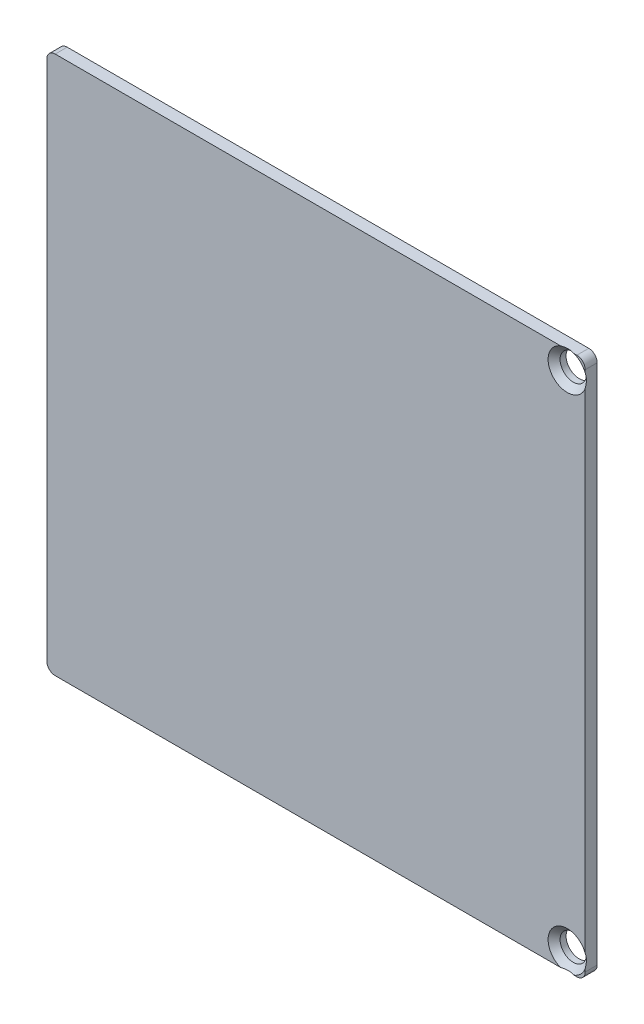
ISO-10303-21;
HEADER;
FILE_DESCRIPTION(('STEP AP214'),'2;1');
FILE_NAME('part.step','',(''),(''),'','','');
FILE_SCHEMA(('AUTOMOTIVE_DESIGN { 1 0 10303 214 1 1 1 1 }'));
ENDSEC;
DATA;
#1=APPLICATION_CONTEXT('core data for automotive mechanical design processes');
#2=APPLICATION_PROTOCOL_DEFINITION('international standard','automotive_design',2000,#1);
#3=PRODUCT_CONTEXT('',#1,'mechanical');
#4=PRODUCT('Part','Part','',(#3));
#5=PRODUCT_RELATED_PRODUCT_CATEGORY('part','',(#4));
#6=PRODUCT_DEFINITION_FORMATION('','',#4);
#7=PRODUCT_DEFINITION_CONTEXT('part definition',#1,'design');
#8=PRODUCT_DEFINITION('design','',#6,#7);
#9=PRODUCT_DEFINITION_SHAPE('','',#8);
#10=(LENGTH_UNIT() NAMED_UNIT(*) SI_UNIT(.MILLI.,.METRE.));
#11=(NAMED_UNIT(*) PLANE_ANGLE_UNIT() SI_UNIT($,.RADIAN.));
#12=(NAMED_UNIT(*) SI_UNIT($,.STERADIAN.) SOLID_ANGLE_UNIT());
#13=UNCERTAINTY_MEASURE_WITH_UNIT(LENGTH_MEASURE(1.E-05),#10,'distance_accuracy_value','');
#14=(GEOMETRIC_REPRESENTATION_CONTEXT(3) GLOBAL_UNCERTAINTY_ASSIGNED_CONTEXT((#13)) GLOBAL_UNIT_ASSIGNED_CONTEXT((#10,
#11,#12)) REPRESENTATION_CONTEXT('',''));
#15=CARTESIAN_POINT('',(0.,0.,0.));
#16=DIRECTION('',(0.,0.,1.));
#17=DIRECTION('',(1.,0.,0.));
#18=AXIS2_PLACEMENT_3D('',#15,#16,#17);
#19=CARTESIAN_POINT('',(21.8,21.8,1.));
#20=DIRECTION('',(0.,0.,1.));
#21=DIRECTION('',(1.,0.,0.));
#22=AXIS2_PLACEMENT_3D('',#19,#20,#21);
#23=PLANE('',#22);
#24=DIRECTION('',(-1.,0.,0.));
#25=VECTOR('',#24,1.);
#26=CARTESIAN_POINT('',(21.8,22.5,1.));
#27=LINE('',#26,#25);
#28=CARTESIAN_POINT('',(21.8,22.5,1.));
#29=VERTEX_POINT('',#28);
#30=CARTESIAN_POINT('',(21.556776436283,22.5,1.));
#31=VERTEX_POINT('',#30);
#32=EDGE_CURVE('E304',#29,#31,#27,.T.);
#33=ORIENTED_EDGE('',*,*,#32,.T.);
#34=CARTESIAN_POINT('',(21.,21.,1.));
#35=DIRECTION('',(0.,0.,1.));
#36=DIRECTION('',(1.,0.,0.));
#37=AXIS2_PLACEMENT_3D('',#34,#35,#36);
#38=CIRCLE('',#37,1.6);
#39=CARTESIAN_POINT('',(22.5,21.556776436283,1.));
#40=VERTEX_POINT('',#39);
#41=EDGE_CURVE('E379',#31,#40,#38,.F.);
#42=ORIENTED_EDGE('',*,*,#41,.T.);
#43=DIRECTION('',(0.,1.,0.));
#44=VECTOR('',#43,1.);
#45=CARTESIAN_POINT('',(22.5,-21.8,1.));
#46=LINE('',#45,#44);
#47=CARTESIAN_POINT('',(22.5,21.8,1.));
#48=VERTEX_POINT('',#47);
#49=EDGE_CURVE('E319',#40,#48,#46,.T.);
#50=ORIENTED_EDGE('',*,*,#49,.T.);
#51=CARTESIAN_POINT('',(21.8,21.8,1.));
#52=DIRECTION('',(0.,0.,1.));
#53=DIRECTION('',(1.,0.,0.));
#54=AXIS2_PLACEMENT_3D('',#51,#52,#53);
#55=CIRCLE('',#54,0.699999999999999);
#56=EDGE_CURVE('E299',#48,#29,#55,.T.);
#57=ORIENTED_EDGE('',*,*,#56,.T.);
#58=EDGE_LOOP('',(#33,#42,#50,#57));
#59=FACE_BOUND('',#58,.T.);
#60=ADVANCED_FACE('F39',(#59),#23,.T.);
#61=CARTESIAN_POINT('',(22.5,-20.443223563717,1.));
#62=VERTEX_POINT('',#61);
#63=CARTESIAN_POINT('',(22.5,20.443223563717,1.));
#64=VERTEX_POINT('',#63);
#65=EDGE_CURVE('E324',#62,#64,#46,.T.);
#66=ORIENTED_EDGE('',*,*,#65,.T.);
#67=CARTESIAN_POINT('',(21.,21.,1.));
#68=DIRECTION('',(0.,0.,1.));
#69=DIRECTION('',(1.,0.,0.));
#70=AXIS2_PLACEMENT_3D('',#67,#68,#69);
#71=CIRCLE('',#70,1.6);
#72=CARTESIAN_POINT('',(20.443223563717,22.5,1.));
#73=VERTEX_POINT('',#72);
#74=EDGE_CURVE('E377',#64,#73,#71,.F.);
#75=ORIENTED_EDGE('',*,*,#74,.T.);
#76=CARTESIAN_POINT('',(-21.8,22.5,1.));
#77=VERTEX_POINT('',#76);
#78=EDGE_CURVE('E302',#73,#77,#27,.T.);
#79=ORIENTED_EDGE('',*,*,#78,.T.);
#80=CARTESIAN_POINT('',(-21.8,21.8,1.));
#81=DIRECTION('',(0.,0.,1.));
#82=DIRECTION('',(1.,0.,0.));
#83=AXIS2_PLACEMENT_3D('',#80,#81,#82);
#84=CIRCLE('',#83,0.700000000000001);
#85=CARTESIAN_POINT('',(-22.5,21.8,1.));
#86=VERTEX_POINT('',#85);
#87=EDGE_CURVE('E307',#77,#86,#84,.T.);
#88=ORIENTED_EDGE('',*,*,#87,.T.);
#89=DIRECTION('',(0.,-1.,0.));
#90=VECTOR('',#89,1.);
#91=CARTESIAN_POINT('',(-22.5,21.8,1.));
#92=LINE('',#91,#90);
#93=CARTESIAN_POINT('',(-22.5,-21.8,1.));
#94=VERTEX_POINT('',#93);
#95=EDGE_CURVE('E309',#86,#94,#92,.T.);
#96=ORIENTED_EDGE('',*,*,#95,.T.);
#97=CARTESIAN_POINT('',(-21.8,-21.8,1.));
#98=DIRECTION('',(0.,0.,1.));
#99=DIRECTION('',(1.,0.,0.));
#100=AXIS2_PLACEMENT_3D('',#97,#98,#99);
#101=CIRCLE('',#100,0.699999999999999);
#102=CARTESIAN_POINT('',(-21.8,-22.5,1.));
#103=VERTEX_POINT('',#102);
#104=EDGE_CURVE('E311',#94,#103,#101,.T.);
#105=ORIENTED_EDGE('',*,*,#104,.T.);
#106=DIRECTION('',(1.,0.,0.));
#107=VECTOR('',#106,1.);
#108=CARTESIAN_POINT('',(-21.8,-22.5,1.));
#109=LINE('',#108,#107);
#110=CARTESIAN_POINT('',(20.443223563717,-22.5,1.));
#111=VERTEX_POINT('',#110);
#112=EDGE_CURVE('E314',#103,#111,#109,.T.);
#113=ORIENTED_EDGE('',*,*,#112,.T.);
#114=CARTESIAN_POINT('',(21.,-21.,1.));
#115=DIRECTION('',(0.,0.,1.));
#116=DIRECTION('',(1.,0.,0.));
#117=AXIS2_PLACEMENT_3D('',#114,#115,#116);
#118=CIRCLE('',#117,1.6);
#119=EDGE_CURVE('E374',#111,#62,#118,.F.);
#120=ORIENTED_EDGE('',*,*,#119,.T.);
#121=EDGE_LOOP('',(#66,#75,#79,#88,#96,#105,#113,#120));
#122=FACE_BOUND('',#121,.T.);
#123=ADVANCED_FACE('F497',(#122),#23,.T.);
#124=CARTESIAN_POINT('',(21.8,21.8,0.));
#125=DIRECTION('',(0.,0.,1.));
#126=DIRECTION('',(1.,0.,0.));
#127=AXIS2_PLACEMENT_3D('',#124,#125,#126);
#128=PLANE('',#127);
#129=CARTESIAN_POINT('',(21.,21.,0.));
#130=DIRECTION('',(0.,0.,-1.));
#131=DIRECTION('',(-1.,0.,0.));
#132=AXIS2_PLACEMENT_3D('',#129,#130,#131);
#133=CIRCLE('',#132,1.09999999999999);
#134=CARTESIAN_POINT('',(19.9,21.,0.));
#135=VERTEX_POINT('',#134);
#136=EDGE_CURVE('E268',#135,#135,#133,.T.);
#137=ORIENTED_EDGE('',*,*,#136,.F.);
#138=EDGE_LOOP('',(#137));
#139=FACE_BOUND('',#138,.T.);
#140=CARTESIAN_POINT('',(21.,-21.,0.));
#141=DIRECTION('',(0.,0.,-1.));
#142=DIRECTION('',(-1.,0.,0.));
#143=AXIS2_PLACEMENT_3D('',#140,#141,#142);
#144=CIRCLE('',#143,1.09999999999999);
#145=CARTESIAN_POINT('',(19.9,-21.,0.));
#146=VERTEX_POINT('',#145);
#147=EDGE_CURVE('E272',#146,#146,#144,.T.);
#148=ORIENTED_EDGE('',*,*,#147,.F.);
#149=EDGE_LOOP('',(#148));
#150=FACE_BOUND('',#149,.T.);
#151=DIRECTION('',(-1.,0.,0.));
#152=VECTOR('',#151,1.);
#153=CARTESIAN_POINT('',(-22.5,-14.5,0.));
#154=LINE('',#153,#152);
#155=CARTESIAN_POINT('',(-20.5,-14.5,0.));
#156=VERTEX_POINT('',#155);
#157=CARTESIAN_POINT('',(-22.5,-14.5,0.));
#158=VERTEX_POINT('',#157);
#159=EDGE_CURVE('E280',#156,#158,#154,.T.);
#160=ORIENTED_EDGE('',*,*,#159,.F.);
#161=DIRECTION('',(0.,-1.,0.));
#162=VECTOR('',#161,1.);
#163=CARTESIAN_POINT('',(-20.5,14.5,0.));
#164=LINE('',#163,#162);
#165=CARTESIAN_POINT('',(-20.5,14.5,0.));
#166=VERTEX_POINT('',#165);
#167=EDGE_CURVE('E286',#166,#156,#164,.T.);
#168=ORIENTED_EDGE('',*,*,#167,.F.);
#169=DIRECTION('',(1.,0.,0.));
#170=VECTOR('',#169,1.);
#171=CARTESIAN_POINT('',(-22.5,14.5,0.));
#172=LINE('',#171,#170);
#173=CARTESIAN_POINT('',(-22.5,14.5,0.));
#174=VERTEX_POINT('',#173);
#175=EDGE_CURVE('E271',#174,#166,#172,.T.);
#176=ORIENTED_EDGE('',*,*,#175,.F.);
#177=DIRECTION('',(0.,-1.,0.));
#178=VECTOR('',#177,1.);
#179=CARTESIAN_POINT('',(-22.5,21.8,0.));
#180=LINE('',#179,#178);
#181=CARTESIAN_POINT('',(-22.5,21.8,0.));
#182=VERTEX_POINT('',#181);
#183=EDGE_CURVE('E332',#182,#174,#180,.T.);
#184=ORIENTED_EDGE('',*,*,#183,.F.);
#185=CARTESIAN_POINT('',(-21.8,21.8,0.));
#186=DIRECTION('',(0.,0.,1.));
#187=DIRECTION('',(1.,0.,0.));
#188=AXIS2_PLACEMENT_3D('',#185,#186,#187);
#189=CIRCLE('',#188,0.700000000000001);
#190=CARTESIAN_POINT('',(-21.8,22.5,0.));
#191=VERTEX_POINT('',#190);
#192=EDGE_CURVE('E329',#191,#182,#189,.T.);
#193=ORIENTED_EDGE('',*,*,#192,.F.);
#194=DIRECTION('',(-1.,0.,0.));
#195=VECTOR('',#194,1.);
#196=CARTESIAN_POINT('',(21.8,22.5,0.));
#197=LINE('',#196,#195);
#198=CARTESIAN_POINT('',(21.8,22.5,0.));
#199=VERTEX_POINT('',#198);
#200=EDGE_CURVE('E327',#199,#191,#197,.T.);
#201=ORIENTED_EDGE('',*,*,#200,.F.);
#202=CARTESIAN_POINT('',(21.8,21.8,0.));
#203=DIRECTION('',(0.,0.,1.));
#204=DIRECTION('',(1.,0.,0.));
#205=AXIS2_PLACEMENT_3D('',#202,#203,#204);
#206=CIRCLE('',#205,0.699999999999999);
#207=CARTESIAN_POINT('',(22.5,21.8,0.));
#208=VERTEX_POINT('',#207);
#209=EDGE_CURVE('E298',#208,#199,#206,.T.);
#210=ORIENTED_EDGE('',*,*,#209,.F.);
#211=DIRECTION('',(0.,1.,0.));
#212=VECTOR('',#211,1.);
#213=CARTESIAN_POINT('',(22.5,-21.8,0.));
#214=LINE('',#213,#212);
#215=CARTESIAN_POINT('',(22.5,-21.8,0.));
#216=VERTEX_POINT('',#215);
#217=EDGE_CURVE('E303',#216,#208,#214,.T.);
#218=ORIENTED_EDGE('',*,*,#217,.F.);
#219=CARTESIAN_POINT('',(21.8,-21.8,0.));
#220=DIRECTION('',(0.,0.,1.));
#221=DIRECTION('',(1.,0.,0.));
#222=AXIS2_PLACEMENT_3D('',#219,#220,#221);
#223=CIRCLE('',#222,0.699999999999999);
#224=CARTESIAN_POINT('',(21.8,-22.5,0.));
#225=VERTEX_POINT('',#224);
#226=EDGE_CURVE('E339',#225,#216,#223,.T.);
#227=ORIENTED_EDGE('',*,*,#226,.F.);
#228=DIRECTION('',(1.,0.,0.));
#229=VECTOR('',#228,1.);
#230=CARTESIAN_POINT('',(-21.8,-22.5,0.));
#231=LINE('',#230,#229);
#232=CARTESIAN_POINT('',(-21.8,-22.5,0.));
#233=VERTEX_POINT('',#232);
#234=EDGE_CURVE('E337',#233,#225,#231,.T.);
#235=ORIENTED_EDGE('',*,*,#234,.F.);
#236=CARTESIAN_POINT('',(-21.8,-21.8,0.));
#237=DIRECTION('',(0.,0.,1.));
#238=DIRECTION('',(1.,0.,0.));
#239=AXIS2_PLACEMENT_3D('',#236,#237,#238);
#240=CIRCLE('',#239,0.699999999999999);
#241=CARTESIAN_POINT('',(-22.5,-21.8,0.));
#242=VERTEX_POINT('',#241);
#243=EDGE_CURVE('E335',#242,#233,#240,.T.);
#244=ORIENTED_EDGE('',*,*,#243,.F.);
#245=EDGE_CURVE('E331',#158,#242,#180,.T.);
#246=ORIENTED_EDGE('',*,*,#245,.F.);
#247=EDGE_LOOP('',(#160,#168,#176,#184,#193,#201,#210,#218,#227,#235,#244,#246));
#248=FACE_BOUND('',#247,.T.);
#249=ADVANCED_FACE('F408',(#139,#150,#248),#128,.F.);
#250=CARTESIAN_POINT('',(21.8,21.8,1.));
#251=DIRECTION('',(0.,0.,-1.));
#252=DIRECTION('',(-1.,0.,0.));
#253=AXIS2_PLACEMENT_3D('',#250,#251,#252);
#254=CYLINDRICAL_SURFACE('',#253,0.699999999999999);
#255=ORIENTED_EDGE('',*,*,#209,.T.);
#256=DIRECTION('',(0.,0.,-1.));
#257=VECTOR('',#256,1.);
#258=CARTESIAN_POINT('',(21.8,22.5,1.));
#259=LINE('',#258,#257);
#260=EDGE_CURVE('E362',#29,#199,#259,.T.);
#261=ORIENTED_EDGE('',*,*,#260,.F.);
#262=ORIENTED_EDGE('',*,*,#56,.F.);
#263=DIRECTION('',(0.,0.,-1.));
#264=VECTOR('',#263,1.);
#265=CARTESIAN_POINT('',(22.5,21.8,1.));
#266=LINE('',#265,#264);
#267=EDGE_CURVE('E323',#48,#208,#266,.T.);
#268=ORIENTED_EDGE('',*,*,#267,.T.);
#269=EDGE_LOOP('',(#255,#261,#262,#268));
#270=FACE_BOUND('',#269,.T.);
#271=ADVANCED_FACE('F541',(#270),#254,.T.);
#272=CARTESIAN_POINT('',(21.8,22.5,1.));
#273=DIRECTION('',(0.,-1.,0.));
#274=DIRECTION('',(0.,0.,-1.));
#275=AXIS2_PLACEMENT_3D('',#272,#273,#274);
#276=PLANE('',#275);
#277=ORIENTED_EDGE('',*,*,#78,.F.);
#278=CARTESIAN_POINT('',(20.443223563717,22.5,1.));
#279=CARTESIAN_POINT('',(20.4901398661828,22.5,0.983656956916377));
#280=CARTESIAN_POINT('',(20.5376736613849,22.5,0.968944210534792));
#281=CARTESIAN_POINT('',(20.6338568425071,22.5,0.943347831970121));
#282=CARTESIAN_POINT('',(20.6825082839452,22.5,0.932471977717173));
#283=CARTESIAN_POINT('',(20.7790600561944,22.5,0.915462793308554));
#284=CARTESIAN_POINT('',(20.8269352404705,22.5,0.909189937193762));
#285=CARTESIAN_POINT('',(20.9230206074008,22.5,0.90121237310164));
#286=CARTESIAN_POINT('',(20.9712303839289,22.5,0.899502858806287));
#287=CARTESIAN_POINT('',(21.0644551533076,22.5,0.900707783275172));
#288=CARTESIAN_POINT('',(21.1094742478829,22.5,0.903329069983885));
#289=CARTESIAN_POINT('',(21.1991455952824,22.5,0.912503518861336));
#290=CARTESIAN_POINT('',(21.2437974889611,22.5,0.919060151917192));
#291=CARTESIAN_POINT('',(21.3337675235513,22.5,0.93603061316341));
#292=CARTESIAN_POINT('',(21.3790640860804,22.5,0.946556591423081));
#293=CARTESIAN_POINT('',(21.4686751102713,22.5,0.970920235810036));
#294=CARTESIAN_POINT('',(21.5129912012548,22.5,0.984751872825993));
#295=CARTESIAN_POINT('',(21.556776436283,22.5,1.));
#296=B_SPLINE_CURVE_WITH_KNOTS('',3,(#278,#279,#280,#281,#282,#283,#284,#285,#286,#287,#288,
#289,#290,#291,#292,#293,#294,#295),.UNSPECIFIED.,.F.,.F.,(4,2,2,2,2,2,2,2,4),(0.,
0.149085120699091,0.298470744840816,0.443116532615554,0.587609912681613,0.722717203804537,
0.857943831988017,0.997318541269532,1.13644096268335),.UNSPECIFIED.);
#297=EDGE_CURVE('E550',#73,#31,#296,.T.);
#298=ORIENTED_EDGE('',*,*,#297,.T.);
#299=ORIENTED_EDGE('',*,*,#32,.F.);
#300=ORIENTED_EDGE('',*,*,#260,.T.);
#301=ORIENTED_EDGE('',*,*,#200,.T.);
#302=DIRECTION('',(0.,0.,-1.));
#303=VECTOR('',#302,1.);
#304=CARTESIAN_POINT('',(-21.8,22.5,1.));
#305=LINE('',#304,#303);
#306=EDGE_CURVE('E359',#77,#191,#305,.T.);
#307=ORIENTED_EDGE('',*,*,#306,.F.);
#308=EDGE_LOOP('',(#277,#298,#299,#300,#301,#307));
#309=FACE_BOUND('',#308,.T.);
#310=ADVANCED_FACE('F548',(#309),#276,.F.);
#311=CARTESIAN_POINT('',(-21.8,21.8,1.));
#312=DIRECTION('',(0.,0.,-1.));
#313=DIRECTION('',(-1.,0.,0.));
#314=AXIS2_PLACEMENT_3D('',#311,#312,#313);
#315=CYLINDRICAL_SURFACE('',#314,0.700000000000001);
#316=ORIENTED_EDGE('',*,*,#192,.T.);
#317=DIRECTION('',(0.,0.,-1.));
#318=VECTOR('',#317,1.);
#319=CARTESIAN_POINT('',(-22.5,21.8,1.));
#320=LINE('',#319,#318);
#321=EDGE_CURVE('E356',#86,#182,#320,.T.);
#322=ORIENTED_EDGE('',*,*,#321,.F.);
#323=ORIENTED_EDGE('',*,*,#87,.F.);
#324=ORIENTED_EDGE('',*,*,#306,.T.);
#325=EDGE_LOOP('',(#316,#322,#323,#324));
#326=FACE_BOUND('',#325,.T.);
#327=ADVANCED_FACE('F568',(#326),#315,.T.);
#328=CARTESIAN_POINT('',(-22.5,21.8,1.));
#329=DIRECTION('',(1.,0.,0.));
#330=DIRECTION('',(0.,1.,0.));
#331=AXIS2_PLACEMENT_3D('',#328,#329,#330);
#332=PLANE('',#331);
#333=DIRECTION('',(0.,0.,-1.));
#334=VECTOR('',#333,1.);
#335=CARTESIAN_POINT('',(-22.5,5.,-4.49999999999999));
#336=LINE('',#335,#334);
#337=CARTESIAN_POINT('',(-22.5,5.,-1.50000000000001));
#338=VERTEX_POINT('',#337);
#339=CARTESIAN_POINT('',(-22.5,5.,-4.49999999999999));
#340=VERTEX_POINT('',#339);
#341=EDGE_CURVE('E224',#338,#340,#336,.T.);
#342=ORIENTED_EDGE('',*,*,#341,.F.);
#343=CARTESIAN_POINT('',(-22.5,4.,-1.5));
#344=DIRECTION('',(-1.,0.,0.));
#345=DIRECTION('',(0.,1.,0.));
#346=AXIS2_PLACEMENT_3D('',#343,#344,#345);
#347=CIRCLE('',#346,1.);
#348=CARTESIAN_POINT('',(-22.5,3.99999999999999,-0.5));
#349=VERTEX_POINT('',#348);
#350=EDGE_CURVE('E54',#349,#338,#347,.T.);
#351=ORIENTED_EDGE('',*,*,#350,.F.);
#352=DIRECTION('',(0.,1.,0.));
#353=VECTOR('',#352,1.);
#354=CARTESIAN_POINT('',(-22.5,3.99999999999999,-0.5));
#355=LINE('',#354,#353);
#356=CARTESIAN_POINT('',(-22.5,-3.99999999999999,-0.499999999999999));
#357=VERTEX_POINT('',#356);
#358=EDGE_CURVE('E246',#357,#349,#355,.T.);
#359=ORIENTED_EDGE('',*,*,#358,.F.);
#360=CARTESIAN_POINT('',(-22.5,-4.,-1.5));
#361=DIRECTION('',(-1.,0.,0.));
#362=DIRECTION('',(0.,-1.,0.));
#363=AXIS2_PLACEMENT_3D('',#360,#361,#362);
#364=CIRCLE('',#363,1.);
#365=CARTESIAN_POINT('',(-22.5,-5.,-1.50000000000001));
#366=VERTEX_POINT('',#365);
#367=EDGE_CURVE('E243',#366,#357,#364,.T.);
#368=ORIENTED_EDGE('',*,*,#367,.F.);
#369=DIRECTION('',(0.,0.,1.));
#370=VECTOR('',#369,1.);
#371=CARTESIAN_POINT('',(-22.5,-5.,-4.49999999999999));
#372=LINE('',#371,#370);
#373=CARTESIAN_POINT('',(-22.5,-5.,-4.5));
#374=VERTEX_POINT('',#373);
#375=EDGE_CURVE('E240',#374,#366,#372,.T.);
#376=ORIENTED_EDGE('',*,*,#375,.F.);
#377=CARTESIAN_POINT('',(-22.5,-4.,-4.5));
#378=DIRECTION('',(-1.,0.,0.));
#379=DIRECTION('',(0.,-1.,0.));
#380=AXIS2_PLACEMENT_3D('',#377,#378,#379);
#381=CIRCLE('',#380,1.);
#382=CARTESIAN_POINT('',(-22.5,-3.99999999999999,-5.5));
#383=VERTEX_POINT('',#382);
#384=EDGE_CURVE('E234',#383,#374,#381,.T.);
#385=ORIENTED_EDGE('',*,*,#384,.F.);
#386=DIRECTION('',(0.,-1.,0.));
#387=VECTOR('',#386,1.);
#388=CARTESIAN_POINT('',(-22.5,3.99999999999999,-5.5));
#389=LINE('',#388,#387);
#390=CARTESIAN_POINT('',(-22.5,3.99999999999999,-5.5));
#391=VERTEX_POINT('',#390);
#392=EDGE_CURVE('E232',#391,#383,#389,.T.);
#393=ORIENTED_EDGE('',*,*,#392,.F.);
#394=CARTESIAN_POINT('',(-22.5,4.,-4.5));
#395=DIRECTION('',(-1.,0.,0.));
#396=DIRECTION('',(0.,-1.,0.));
#397=AXIS2_PLACEMENT_3D('',#394,#395,#396);
#398=CIRCLE('',#397,1.);
#399=EDGE_CURVE('E215',#340,#391,#398,.T.);
#400=ORIENTED_EDGE('',*,*,#399,.F.);
#401=EDGE_LOOP('',(#342,#351,#359,#368,#376,#385,#393,#400));
#402=FACE_BOUND('',#401,.T.);
#403=CARTESIAN_POINT('',(-22.5,10.,-3.5));
#404=DIRECTION('',(-1.,0.,0.));
#405=DIRECTION('',(0.,-1.,0.));
#406=AXIS2_PLACEMENT_3D('',#403,#404,#405);
#407=CIRCLE('',#406,0.8);
#408=CARTESIAN_POINT('',(-22.5,9.2,-3.5));
#409=VERTEX_POINT('',#408);
#410=EDGE_CURVE('E262',#409,#409,#407,.T.);
#411=ORIENTED_EDGE('',*,*,#410,.F.);
#412=EDGE_LOOP('',(#411));
#413=FACE_BOUND('',#412,.T.);
#414=CARTESIAN_POINT('',(-22.5,-10.,-3.5));
#415=DIRECTION('',(-1.,0.,0.));
#416=DIRECTION('',(0.,-1.,0.));
#417=AXIS2_PLACEMENT_3D('',#414,#415,#416);
#418=CIRCLE('',#417,0.8);
#419=CARTESIAN_POINT('',(-22.5,-10.8,-3.5));
#420=VERTEX_POINT('',#419);
#421=EDGE_CURVE('E251',#420,#420,#418,.T.);
#422=ORIENTED_EDGE('',*,*,#421,.F.);
#423=EDGE_LOOP('',(#422));
#424=FACE_BOUND('',#423,.T.);
#425=DIRECTION('',(0.,0.,1.));
#426=VECTOR('',#425,1.);
#427=CARTESIAN_POINT('',(-22.5,14.5,-7.));
#428=LINE('',#427,#426);
#429=CARTESIAN_POINT('',(-22.5,14.5,-3.));
#430=VERTEX_POINT('',#429);
#431=EDGE_CURVE('E296',#430,#174,#428,.T.);
#432=ORIENTED_EDGE('',*,*,#431,.F.);
#433=CARTESIAN_POINT('',(-22.5,10.5,-3.));
#434=DIRECTION('',(1.,0.,0.));
#435=DIRECTION('',(0.,1.,0.));
#436=AXIS2_PLACEMENT_3D('',#433,#434,#435);
#437=CIRCLE('',#436,4.);
#438=CARTESIAN_POINT('',(-22.5,10.5,-7.));
#439=VERTEX_POINT('',#438);
#440=EDGE_CURVE('E444',#430,#439,#437,.F.);
#441=ORIENTED_EDGE('',*,*,#440,.T.);
#442=DIRECTION('',(0.,1.,0.));
#443=VECTOR('',#442,1.);
#444=CARTESIAN_POINT('',(-22.5,14.5,-7.));
#445=LINE('',#444,#443);
#446=CARTESIAN_POINT('',(-22.5,-10.5,-7.));
#447=VERTEX_POINT('',#446);
#448=EDGE_CURVE('E276',#447,#439,#445,.T.);
#449=ORIENTED_EDGE('',*,*,#448,.F.);
#450=CARTESIAN_POINT('',(-22.5,-10.5,-3.));
#451=DIRECTION('',(1.,0.,0.));
#452=DIRECTION('',(0.,1.,0.));
#453=AXIS2_PLACEMENT_3D('',#450,#451,#452);
#454=CIRCLE('',#453,4.);
#455=CARTESIAN_POINT('',(-22.5,-14.5,-3.));
#456=VERTEX_POINT('',#455);
#457=EDGE_CURVE('E442',#447,#456,#454,.F.);
#458=ORIENTED_EDGE('',*,*,#457,.T.);
#459=DIRECTION('',(0.,0.,1.));
#460=VECTOR('',#459,1.);
#461=CARTESIAN_POINT('',(-22.5,-14.5,-7.));
#462=LINE('',#461,#460);
#463=EDGE_CURVE('E283',#456,#158,#462,.T.);
#464=ORIENTED_EDGE('',*,*,#463,.T.);
#465=ORIENTED_EDGE('',*,*,#245,.T.);
#466=DIRECTION('',(0.,0.,-1.));
#467=VECTOR('',#466,1.);
#468=CARTESIAN_POINT('',(-22.5,-21.8,1.));
#469=LINE('',#468,#467);
#470=EDGE_CURVE('E353',#94,#242,#469,.T.);
#471=ORIENTED_EDGE('',*,*,#470,.F.);
#472=ORIENTED_EDGE('',*,*,#95,.F.);
#473=ORIENTED_EDGE('',*,*,#321,.T.);
#474=ORIENTED_EDGE('',*,*,#183,.T.);
#475=EDGE_LOOP('',(#432,#441,#449,#458,#464,#465,#471,#472,#473,#474));
#476=FACE_BOUND('',#475,.T.);
#477=ADVANCED_FACE('F228',(#402,#413,#424,#476),#332,.F.);
#478=CARTESIAN_POINT('',(-21.8,-21.8,1.));
#479=DIRECTION('',(0.,0.,-1.));
#480=DIRECTION('',(-1.,0.,0.));
#481=AXIS2_PLACEMENT_3D('',#478,#479,#480);
#482=CYLINDRICAL_SURFACE('',#481,0.699999999999999);
#483=ORIENTED_EDGE('',*,*,#243,.T.);
#484=DIRECTION('',(0.,0.,-1.));
#485=VECTOR('',#484,1.);
#486=CARTESIAN_POINT('',(-21.8,-22.5,1.));
#487=LINE('',#486,#485);
#488=EDGE_CURVE('E350',#103,#233,#487,.T.);
#489=ORIENTED_EDGE('',*,*,#488,.F.);
#490=ORIENTED_EDGE('',*,*,#104,.F.);
#491=ORIENTED_EDGE('',*,*,#470,.T.);
#492=EDGE_LOOP('',(#483,#489,#490,#491));
#493=FACE_BOUND('',#492,.T.);
#494=ADVANCED_FACE('F418',(#493),#482,.T.);
#495=CARTESIAN_POINT('',(-21.8,-22.5,1.));
#496=DIRECTION('',(0.,1.,0.));
#497=DIRECTION('',(0.,0.,1.));
#498=AXIS2_PLACEMENT_3D('',#495,#496,#497);
#499=PLANE('',#498);
#500=CARTESIAN_POINT('',(21.556776436283,-22.5,1.));
#501=VERTEX_POINT('',#500);
#502=CARTESIAN_POINT('',(21.8,-22.5,1.));
#503=VERTEX_POINT('',#502);
#504=EDGE_CURVE('E313',#501,#503,#109,.T.);
#505=ORIENTED_EDGE('',*,*,#504,.F.);
#506=CARTESIAN_POINT('',(21.556776436283,-22.5,1.));
#507=CARTESIAN_POINT('',(21.5098601338173,-22.5,0.983656956916377));
#508=CARTESIAN_POINT('',(21.4623263386151,-22.5,0.968944210534792));
#509=CARTESIAN_POINT('',(21.3661431574929,-22.5,0.943347831970121));
#510=CARTESIAN_POINT('',(21.3174917160548,-22.5,0.932471977717173));
#511=CARTESIAN_POINT('',(21.2209399438056,-22.5,0.915462793308555));
#512=CARTESIAN_POINT('',(21.1730647595295,-22.5,0.909189937193762));
#513=CARTESIAN_POINT('',(21.0769793925993,-22.5,0.90121237310164));
#514=CARTESIAN_POINT('',(21.0287696160711,-22.5,0.899502858806287));
#515=CARTESIAN_POINT('',(20.9355448466924,-22.5,0.900707783275172));
#516=CARTESIAN_POINT('',(20.8905257521171,-22.5,0.903329069983885));
#517=CARTESIAN_POINT('',(20.8008544047177,-22.5,0.912503518861336));
#518=CARTESIAN_POINT('',(20.7562025110389,-22.5,0.919060151917192));
#519=CARTESIAN_POINT('',(20.6662324764487,-22.5,0.93603061316341));
#520=CARTESIAN_POINT('',(20.6209359139196,-22.5,0.946556591423081));
#521=CARTESIAN_POINT('',(20.5313248897287,-22.5,0.970920235810036));
#522=CARTESIAN_POINT('',(20.4870087987452,-22.5,0.984751872825993));
#523=CARTESIAN_POINT('',(20.443223563717,-22.5,1.));
#524=B_SPLINE_CURVE_WITH_KNOTS('',3,(#506,#507,#508,#509,#510,#511,#512,#513,#514,#515,#516,
#517,#518,#519,#520,#521,#522,#523),.UNSPECIFIED.,.F.,.F.,(4,2,2,2,2,2,2,2,4),(0.,
0.149085120699091,0.298470744840816,0.44311653261555,0.587609912681613,0.722717203804537,
0.857943831988017,0.997318541269532,1.13644096268335),.UNSPECIFIED.);
#525=EDGE_CURVE('E422',#501,#111,#524,.T.);
#526=ORIENTED_EDGE('',*,*,#525,.T.);
#527=ORIENTED_EDGE('',*,*,#112,.F.);
#528=ORIENTED_EDGE('',*,*,#488,.T.);
#529=ORIENTED_EDGE('',*,*,#234,.T.);
#530=DIRECTION('',(0.,0.,-1.));
#531=VECTOR('',#530,1.);
#532=CARTESIAN_POINT('',(21.8,-22.5,1.));
#533=LINE('',#532,#531);
#534=EDGE_CURVE('E347',#503,#225,#533,.T.);
#535=ORIENTED_EDGE('',*,*,#534,.F.);
#536=EDGE_LOOP('',(#505,#526,#527,#528,#529,#535));
#537=FACE_BOUND('',#536,.T.);
#538=ADVANCED_FACE('F413',(#537),#499,.F.);
#539=CARTESIAN_POINT('',(21.8,-21.8,1.));
#540=DIRECTION('',(0.,0.,-1.));
#541=DIRECTION('',(-1.,0.,0.));
#542=AXIS2_PLACEMENT_3D('',#539,#540,#541);
#543=CYLINDRICAL_SURFACE('',#542,0.699999999999999);
#544=ORIENTED_EDGE('',*,*,#226,.T.);
#545=DIRECTION('',(0.,0.,-1.));
#546=VECTOR('',#545,1.);
#547=CARTESIAN_POINT('',(22.5,-21.8,1.));
#548=LINE('',#547,#546);
#549=CARTESIAN_POINT('',(22.5,-21.8,1.));
#550=VERTEX_POINT('',#549);
#551=EDGE_CURVE('E344',#550,#216,#548,.T.);
#552=ORIENTED_EDGE('',*,*,#551,.F.);
#553=CARTESIAN_POINT('',(21.8,-21.8,1.));
#554=DIRECTION('',(0.,0.,1.));
#555=DIRECTION('',(1.,0.,0.));
#556=AXIS2_PLACEMENT_3D('',#553,#554,#555);
#557=CIRCLE('',#556,0.699999999999999);
#558=EDGE_CURVE('E317',#503,#550,#557,.T.);
#559=ORIENTED_EDGE('',*,*,#558,.F.);
#560=ORIENTED_EDGE('',*,*,#534,.T.);
#561=EDGE_LOOP('',(#544,#552,#559,#560));
#562=FACE_BOUND('',#561,.T.);
#563=ADVANCED_FACE('F406',(#562),#543,.T.);
#564=CARTESIAN_POINT('',(22.5,-21.8,1.));
#565=DIRECTION('',(-1.,0.,0.));
#566=DIRECTION('',(0.,-1.,0.));
#567=AXIS2_PLACEMENT_3D('',#564,#565,#566);
#568=PLANE('',#567);
#569=ORIENTED_EDGE('',*,*,#49,.F.);
#570=CARTESIAN_POINT('',(22.5,21.556776436283,1.));
#571=CARTESIAN_POINT('',(22.5,21.5098601338172,0.983656956916377));
#572=CARTESIAN_POINT('',(22.5,21.4623263386151,0.968944210534793));
#573=CARTESIAN_POINT('',(22.5,21.3661431574929,0.943347831970123));
#574=CARTESIAN_POINT('',(22.5,21.3174917160548,0.932471977717175));
#575=CARTESIAN_POINT('',(22.5,21.2209399438056,0.915462793308557));
#576=CARTESIAN_POINT('',(22.5,21.1730647595295,0.909189937193765));
#577=CARTESIAN_POINT('',(22.5,21.0769793925993,0.901212373101643));
#578=CARTESIAN_POINT('',(22.5,21.0287696160711,0.89950285880629));
#579=CARTESIAN_POINT('',(22.5,20.9355448466924,0.900707783275175));
#580=CARTESIAN_POINT('',(22.5,20.8905257521171,0.903329069983889));
#581=CARTESIAN_POINT('',(22.5,20.8008544047176,0.912503518861339));
#582=CARTESIAN_POINT('',(22.5,20.7562025110389,0.919060151917195));
#583=CARTESIAN_POINT('',(22.5,20.6662324764487,0.936030613163412));
#584=CARTESIAN_POINT('',(22.5,20.6209359139196,0.946556591423083));
#585=CARTESIAN_POINT('',(22.5,20.5313248897287,0.970920235810037));
#586=CARTESIAN_POINT('',(22.5,20.4870087987452,0.984751872825993));
#587=CARTESIAN_POINT('',(22.5,20.443223563717,1.));
#588=B_SPLINE_CURVE_WITH_KNOTS('',3,(#570,#571,#572,#573,#574,#575,#576,#577,#578,#579,#580,
#581,#582,#583,#584,#585,#586,#587),.UNSPECIFIED.,.F.,.F.,(4,2,2,2,2,2,2,2,4),(0.,
0.149085120699081,0.298470744840808,0.443116532615546,0.587609912681605,0.722717203804526,
0.857943831988003,0.997318541269513,1.13644096268332),.UNSPECIFIED.);
#589=EDGE_CURVE('E390',#40,#64,#588,.T.);
#590=ORIENTED_EDGE('',*,*,#589,.T.);
#591=ORIENTED_EDGE('',*,*,#65,.F.);
#592=CARTESIAN_POINT('',(22.5,-20.443223563717,1.));
#593=CARTESIAN_POINT('',(22.5,-20.4901398661828,0.983656956916377));
#594=CARTESIAN_POINT('',(22.5,-20.5376736613849,0.968944210534792));
#595=CARTESIAN_POINT('',(22.5,-20.6338568425071,0.943347831970121));
#596=CARTESIAN_POINT('',(22.5,-20.6825082839452,0.932471977717173));
#597=CARTESIAN_POINT('',(22.5,-20.7790600561944,0.915462793308555));
#598=CARTESIAN_POINT('',(22.5,-20.8269352404705,0.909189937193762));
#599=CARTESIAN_POINT('',(22.5,-20.9230206074007,0.90121237310164));
#600=CARTESIAN_POINT('',(22.5,-20.9712303839289,0.899502858806287));
#601=CARTESIAN_POINT('',(22.5,-21.0644551533076,0.900707783275172));
#602=CARTESIAN_POINT('',(22.5,-21.1094742478829,0.903329069983885));
#603=CARTESIAN_POINT('',(22.5,-21.1991455952824,0.912503518861336));
#604=CARTESIAN_POINT('',(22.5,-21.2437974889611,0.919060151917192));
#605=CARTESIAN_POINT('',(22.5,-21.3337675235513,0.93603061316341));
#606=CARTESIAN_POINT('',(22.5,-21.3790640860804,0.946556591423081));
#607=CARTESIAN_POINT('',(22.5,-21.4686751102713,0.970920235810037));
#608=CARTESIAN_POINT('',(22.5,-21.5129912012548,0.984751872825993));
#609=CARTESIAN_POINT('',(22.5,-21.556776436283,1.));
#610=B_SPLINE_CURVE_WITH_KNOTS('',3,(#592,#593,#594,#595,#596,#597,#598,#599,#600,#601,#602,
#603,#604,#605,#606,#607,#608,#609),.UNSPECIFIED.,.F.,.F.,(4,2,2,2,2,2,2,2,4),(0.,
0.149085120699091,0.298470744840816,0.44311653261555,0.587609912681613,0.722717203804537,
0.857943831988017,0.997318541269532,1.13644096268335),.UNSPECIFIED.);
#611=CARTESIAN_POINT('',(22.5,-21.556776436283,1.));
#612=VERTEX_POINT('',#611);
#613=EDGE_CURVE('E382',#62,#612,#610,.T.);
#614=ORIENTED_EDGE('',*,*,#613,.T.);
#615=EDGE_CURVE('E320',#550,#612,#46,.T.);
#616=ORIENTED_EDGE('',*,*,#615,.F.);
#617=ORIENTED_EDGE('',*,*,#551,.T.);
#618=ORIENTED_EDGE('',*,*,#217,.T.);
#619=ORIENTED_EDGE('',*,*,#267,.F.);
#620=EDGE_LOOP('',(#569,#590,#591,#614,#616,#617,#618,#619));
#621=FACE_BOUND('',#620,.T.);
#622=ADVANCED_FACE('F400',(#621),#568,.F.);
#623=ORIENTED_EDGE('',*,*,#615,.T.);
#624=CARTESIAN_POINT('',(21.,-21.,1.));
#625=DIRECTION('',(0.,0.,1.));
#626=DIRECTION('',(1.,0.,0.));
#627=AXIS2_PLACEMENT_3D('',#624,#625,#626);
#628=CIRCLE('',#627,1.6);
#629=EDGE_CURVE('E372',#612,#501,#628,.F.);
#630=ORIENTED_EDGE('',*,*,#629,.T.);
#631=ORIENTED_EDGE('',*,*,#504,.T.);
#632=ORIENTED_EDGE('',*,*,#558,.T.);
#633=EDGE_LOOP('',(#623,#630,#631,#632));
#634=FACE_BOUND('',#633,.T.);
#635=ADVANCED_FACE('F405',(#634),#23,.T.);
#636=CARTESIAN_POINT('',(-22.5,14.5,-7.));
#637=DIRECTION('',(0.,-1.,0.));
#638=DIRECTION('',(0.,0.,-1.));
#639=AXIS2_PLACEMENT_3D('',#636,#637,#638);
#640=PLANE('',#639);
#641=DIRECTION('',(0.,0.,1.));
#642=VECTOR('',#641,1.);
#643=CARTESIAN_POINT('',(-20.5,14.5,-7.));
#644=LINE('',#643,#642);
#645=CARTESIAN_POINT('',(-20.5,14.5,-3.));
#646=VERTEX_POINT('',#645);
#647=EDGE_CURVE('E294',#646,#166,#644,.T.);
#648=ORIENTED_EDGE('',*,*,#647,.F.);
#649=DIRECTION('',(1.,0.,0.));
#650=VECTOR('',#649,1.);
#651=CARTESIAN_POINT('',(-22.5,14.5,-3.));
#652=LINE('',#651,#650);
#653=EDGE_CURVE('E440',#646,#430,#652,.F.);
#654=ORIENTED_EDGE('',*,*,#653,.T.);
#655=ORIENTED_EDGE('',*,*,#431,.T.);
#656=ORIENTED_EDGE('',*,*,#175,.T.);
#657=EDGE_LOOP('',(#648,#654,#655,#656));
#658=FACE_BOUND('',#657,.T.);
#659=ADVANCED_FACE('F505',(#658),#640,.F.);
#660=CARTESIAN_POINT('',(-20.5,14.5,-7.));
#661=DIRECTION('',(-1.,0.,0.));
#662=DIRECTION('',(0.,-1.,0.));
#663=AXIS2_PLACEMENT_3D('',#660,#661,#662);
#664=PLANE('',#663);
#665=DIRECTION('',(0.,1.,0.));
#666=VECTOR('',#665,1.);
#667=CARTESIAN_POINT('',(-20.5,14.5,-0.500000000000001));
#668=LINE('',#667,#666);
#669=CARTESIAN_POINT('',(-20.5,-3.99999999999999,-0.499999999999999));
#670=VERTEX_POINT('',#669);
#671=CARTESIAN_POINT('',(-20.5,3.99999999999999,-0.5));
#672=VERTEX_POINT('',#671);
#673=EDGE_CURVE('E47',#670,#672,#668,.T.);
#674=ORIENTED_EDGE('',*,*,#673,.T.);
#675=CARTESIAN_POINT('',(-20.5,4.,-1.5));
#676=DIRECTION('',(-1.,0.,0.));
#677=DIRECTION('',(0.,-1.,0.));
#678=AXIS2_PLACEMENT_3D('',#675,#676,#677);
#679=CIRCLE('',#678,1.);
#680=CARTESIAN_POINT('',(-20.5,5.,-1.50000000000001));
#681=VERTEX_POINT('',#680);
#682=EDGE_CURVE('E11',#672,#681,#679,.T.);
#683=ORIENTED_EDGE('',*,*,#682,.T.);
#684=DIRECTION('',(0.,0.,-1.));
#685=VECTOR('',#684,1.);
#686=CARTESIAN_POINT('',(-20.5,5.,-7.));
#687=LINE('',#686,#685);
#688=CARTESIAN_POINT('',(-20.5,5.,-4.49999999999999));
#689=VERTEX_POINT('',#688);
#690=EDGE_CURVE('E448',#681,#689,#687,.T.);
#691=ORIENTED_EDGE('',*,*,#690,.T.);
#692=CARTESIAN_POINT('',(-20.5,4.,-4.5));
#693=DIRECTION('',(-1.,0.,0.));
#694=DIRECTION('',(0.,-1.,0.));
#695=AXIS2_PLACEMENT_3D('',#692,#693,#694);
#696=CIRCLE('',#695,1.);
#697=CARTESIAN_POINT('',(-20.5,3.99999999999999,-5.5));
#698=VERTEX_POINT('',#697);
#699=EDGE_CURVE('E218',#689,#698,#696,.T.);
#700=ORIENTED_EDGE('',*,*,#699,.T.);
#701=DIRECTION('',(0.,-1.,0.));
#702=VECTOR('',#701,1.);
#703=CARTESIAN_POINT('',(-20.5,14.5,-5.5));
#704=LINE('',#703,#702);
#705=CARTESIAN_POINT('',(-20.5,-3.99999999999999,-5.5));
#706=VERTEX_POINT('',#705);
#707=EDGE_CURVE('E451',#698,#706,#704,.T.);
#708=ORIENTED_EDGE('',*,*,#707,.T.);
#709=CARTESIAN_POINT('',(-20.5,-4.,-4.5));
#710=DIRECTION('',(-1.,0.,0.));
#711=DIRECTION('',(0.,-1.,0.));
#712=AXIS2_PLACEMENT_3D('',#709,#710,#711);
#713=CIRCLE('',#712,1.);
#714=CARTESIAN_POINT('',(-20.5,-5.,-4.5));
#715=VERTEX_POINT('',#714);
#716=EDGE_CURVE('E454',#706,#715,#713,.T.);
#717=ORIENTED_EDGE('',*,*,#716,.T.);
#718=DIRECTION('',(0.,0.,1.));
#719=VECTOR('',#718,1.);
#720=CARTESIAN_POINT('',(-20.5,-5.,-7.));
#721=LINE('',#720,#719);
#722=CARTESIAN_POINT('',(-20.5,-5.,-1.50000000000001));
#723=VERTEX_POINT('',#722);
#724=EDGE_CURVE('E457',#715,#723,#721,.T.);
#725=ORIENTED_EDGE('',*,*,#724,.T.);
#726=CARTESIAN_POINT('',(-20.5,-4.,-1.5));
#727=DIRECTION('',(-1.,0.,0.));
#728=DIRECTION('',(0.,-1.,0.));
#729=AXIS2_PLACEMENT_3D('',#726,#727,#728);
#730=CIRCLE('',#729,1.);
#731=EDGE_CURVE('E460',#723,#670,#730,.T.);
#732=ORIENTED_EDGE('',*,*,#731,.T.);
#733=EDGE_LOOP('',(#674,#683,#691,#700,#708,#717,#725,#732));
#734=FACE_BOUND('',#733,.T.);
#735=CARTESIAN_POINT('',(-20.5,10.,-3.5));
#736=DIRECTION('',(-1.,0.,0.));
#737=DIRECTION('',(0.,-1.,0.));
#738=AXIS2_PLACEMENT_3D('',#735,#736,#737);
#739=CIRCLE('',#738,0.8);
#740=CARTESIAN_POINT('',(-20.5,9.2,-3.5));
#741=VERTEX_POINT('',#740);
#742=EDGE_CURVE('E275',#741,#741,#739,.T.);
#743=ORIENTED_EDGE('',*,*,#742,.T.);
#744=EDGE_LOOP('',(#743));
#745=FACE_BOUND('',#744,.T.);
#746=CARTESIAN_POINT('',(-20.5,-10.,-3.5));
#747=DIRECTION('',(-1.,0.,0.));
#748=DIRECTION('',(0.,-1.,0.));
#749=AXIS2_PLACEMENT_3D('',#746,#747,#748);
#750=CIRCLE('',#749,0.8);
#751=CARTESIAN_POINT('',(-20.5,-10.8,-3.5));
#752=VERTEX_POINT('',#751);
#753=EDGE_CURVE('E265',#752,#752,#750,.T.);
#754=ORIENTED_EDGE('',*,*,#753,.T.);
#755=EDGE_LOOP('',(#754));
#756=FACE_BOUND('',#755,.T.);
#757=DIRECTION('',(0.,-1.,0.));
#758=VECTOR('',#757,1.);
#759=CARTESIAN_POINT('',(-20.5,14.5,-7.));
#760=LINE('',#759,#758);
#761=CARTESIAN_POINT('',(-20.5,10.5,-7.));
#762=VERTEX_POINT('',#761);
#763=CARTESIAN_POINT('',(-20.5,-10.5,-7.));
#764=VERTEX_POINT('',#763);
#765=EDGE_CURVE('E279',#762,#764,#760,.T.);
#766=ORIENTED_EDGE('',*,*,#765,.F.);
#767=CARTESIAN_POINT('',(-20.5,10.5,-3.));
#768=DIRECTION('',(-1.,0.,0.));
#769=DIRECTION('',(0.,-1.,0.));
#770=AXIS2_PLACEMENT_3D('',#767,#768,#769);
#771=CIRCLE('',#770,4.);
#772=EDGE_CURVE('E438',#762,#646,#771,.F.);
#773=ORIENTED_EDGE('',*,*,#772,.T.);
#774=ORIENTED_EDGE('',*,*,#647,.T.);
#775=ORIENTED_EDGE('',*,*,#167,.T.);
#776=DIRECTION('',(0.,0.,1.));
#777=VECTOR('',#776,1.);
#778=CARTESIAN_POINT('',(-20.5,-14.5,-7.));
#779=LINE('',#778,#777);
#780=CARTESIAN_POINT('',(-20.5,-14.5,-3.));
#781=VERTEX_POINT('',#780);
#782=EDGE_CURVE('E292',#781,#156,#779,.T.);
#783=ORIENTED_EDGE('',*,*,#782,.F.);
#784=CARTESIAN_POINT('',(-20.5,-10.5,-3.));
#785=DIRECTION('',(-1.,0.,0.));
#786=DIRECTION('',(0.,-1.,0.));
#787=AXIS2_PLACEMENT_3D('',#784,#785,#786);
#788=CIRCLE('',#787,4.);
#789=EDGE_CURVE('E436',#781,#764,#788,.F.);
#790=ORIENTED_EDGE('',*,*,#789,.T.);
#791=EDGE_LOOP('',(#766,#773,#774,#775,#783,#790));
#792=FACE_BOUND('',#791,.T.);
#793=ADVANCED_FACE('F464',(#734,#745,#756,#792),#664,.F.);
#794=CARTESIAN_POINT('',(-22.5,-14.5,-7.));
#795=DIRECTION('',(0.,1.,0.));
#796=DIRECTION('',(0.,0.,1.));
#797=AXIS2_PLACEMENT_3D('',#794,#795,#796);
#798=PLANE('',#797);
#799=ORIENTED_EDGE('',*,*,#463,.F.);
#800=DIRECTION('',(-1.,0.,0.));
#801=VECTOR('',#800,1.);
#802=CARTESIAN_POINT('',(-22.5,-14.5,-3.));
#803=LINE('',#802,#801);
#804=EDGE_CURVE('E446',#456,#781,#803,.F.);
#805=ORIENTED_EDGE('',*,*,#804,.T.);
#806=ORIENTED_EDGE('',*,*,#782,.T.);
#807=ORIENTED_EDGE('',*,*,#159,.T.);
#808=EDGE_LOOP('',(#799,#805,#806,#807));
#809=FACE_BOUND('',#808,.T.);
#810=ADVANCED_FACE('F593',(#809),#798,.F.);
#811=CARTESIAN_POINT('',(0.,0.,-7.));
#812=DIRECTION('',(0.,0.,1.));
#813=DIRECTION('',(1.,0.,0.));
#814=AXIS2_PLACEMENT_3D('',#811,#812,#813);
#815=PLANE('',#814);
#816=ORIENTED_EDGE('',*,*,#448,.T.);
#817=DIRECTION('',(1.,0.,0.));
#818=VECTOR('',#817,1.);
#819=CARTESIAN_POINT('',(0.,10.5,-7.));
#820=LINE('',#819,#818);
#821=EDGE_CURVE('E433',#439,#762,#820,.T.);
#822=ORIENTED_EDGE('',*,*,#821,.T.);
#823=ORIENTED_EDGE('',*,*,#765,.T.);
#824=DIRECTION('',(-1.,0.,0.));
#825=VECTOR('',#824,1.);
#826=CARTESIAN_POINT('',(0.,-10.5,-7.));
#827=LINE('',#826,#825);
#828=EDGE_CURVE('E429',#764,#447,#827,.T.);
#829=ORIENTED_EDGE('',*,*,#828,.T.);
#830=EDGE_LOOP('',(#816,#822,#823,#829));
#831=FACE_BOUND('',#830,.T.);
#832=ADVANCED_FACE('F583',(#831),#815,.F.);
#833=CARTESIAN_POINT('',(21.,-21.,7.));
#834=DIRECTION('',(0.,0.,-1.));
#835=DIRECTION('',(-1.,0.,0.));
#836=AXIS2_PLACEMENT_3D('',#833,#834,#835);
#837=CYLINDRICAL_SURFACE('',#836,1.09999999999999);
#838=CARTESIAN_POINT('',(21.,-21.,0.499999999999987));
#839=DIRECTION('',(0.,0.,1.));
#840=DIRECTION('',(1.,0.,0.));
#841=AXIS2_PLACEMENT_3D('',#838,#839,#840);
#842=CIRCLE('',#841,1.09999999999999);
#843=CARTESIAN_POINT('',(22.1,-21.,0.499999999999987));
#844=VERTEX_POINT('',#843);
#845=EDGE_CURVE('E430',#844,#844,#842,.T.);
#846=ORIENTED_EDGE('',*,*,#845,.T.);
#847=EDGE_LOOP('',(#846));
#848=FACE_BOUND('',#847,.T.);
#849=ORIENTED_EDGE('',*,*,#147,.T.);
#850=EDGE_LOOP('',(#849));
#851=FACE_BOUND('',#850,.T.);
#852=ADVANCED_FACE('F580',(#848,#851),#837,.F.);
#853=CARTESIAN_POINT('',(21.,21.,7.));
#854=DIRECTION('',(0.,0.,-1.));
#855=DIRECTION('',(-1.,0.,0.));
#856=AXIS2_PLACEMENT_3D('',#853,#854,#855);
#857=CYLINDRICAL_SURFACE('',#856,1.09999999999999);
#858=CARTESIAN_POINT('',(21.,21.,0.499999999999987));
#859=DIRECTION('',(0.,0.,1.));
#860=DIRECTION('',(1.,0.,0.));
#861=AXIS2_PLACEMENT_3D('',#858,#859,#860);
#862=CIRCLE('',#861,1.09999999999999);
#863=CARTESIAN_POINT('',(22.1,21.,0.499999999999987));
#864=VERTEX_POINT('',#863);
#865=EDGE_CURVE('E365',#864,#864,#862,.T.);
#866=ORIENTED_EDGE('',*,*,#865,.T.);
#867=EDGE_LOOP('',(#866));
#868=FACE_BOUND('',#867,.T.);
#869=ORIENTED_EDGE('',*,*,#136,.T.);
#870=EDGE_LOOP('',(#869));
#871=FACE_BOUND('',#870,.T.);
#872=ADVANCED_FACE('F582',(#868,#871),#857,.F.);
#873=CARTESIAN_POINT('',(-15.5,-10.,-3.5));
#874=DIRECTION('',(-1.,0.,0.));
#875=DIRECTION('',(0.,-1.,0.));
#876=AXIS2_PLACEMENT_3D('',#873,#874,#875);
#877=CYLINDRICAL_SURFACE('',#876,0.8);
#878=ORIENTED_EDGE('',*,*,#421,.T.);
#879=EDGE_LOOP('',(#878));
#880=FACE_BOUND('',#879,.T.);
#881=ORIENTED_EDGE('',*,*,#753,.F.);
#882=EDGE_LOOP('',(#881));
#883=FACE_BOUND('',#882,.T.);
#884=ADVANCED_FACE('F590',(#880,#883),#877,.F.);
#885=CARTESIAN_POINT('',(-15.5,10.,-3.5));
#886=DIRECTION('',(-1.,0.,0.));
#887=DIRECTION('',(0.,-1.,0.));
#888=AXIS2_PLACEMENT_3D('',#885,#886,#887);
#889=CYLINDRICAL_SURFACE('',#888,0.8);
#890=ORIENTED_EDGE('',*,*,#410,.T.);
#891=EDGE_LOOP('',(#890));
#892=FACE_BOUND('',#891,.T.);
#893=ORIENTED_EDGE('',*,*,#742,.F.);
#894=EDGE_LOOP('',(#893));
#895=FACE_BOUND('',#894,.T.);
#896=ADVANCED_FACE('F708',(#892,#895),#889,.F.);
#897=CARTESIAN_POINT('',(21.,21.,0.499999999999987));
#898=DIRECTION('',(0.,0.,1.));
#899=DIRECTION('',(1.,0.,0.));
#900=AXIS2_PLACEMENT_3D('',#897,#898,#899);
#901=CONICAL_SURFACE('',#900,1.09999999999999,0.785398163397445);
#902=ORIENTED_EDGE('',*,*,#589,.F.);
#903=ORIENTED_EDGE('',*,*,#41,.F.);
#904=ORIENTED_EDGE('',*,*,#297,.F.);
#905=ORIENTED_EDGE('',*,*,#74,.F.);
#906=EDGE_LOOP('',(#902,#903,#904,#905));
#907=FACE_BOUND('',#906,.T.);
#908=ORIENTED_EDGE('',*,*,#865,.F.);
#909=EDGE_LOOP('',(#908));
#910=FACE_BOUND('',#909,.T.);
#911=ADVANCED_FACE('F554',(#907,#910),#901,.F.);
#912=CARTESIAN_POINT('',(21.,-21.,0.499999999999987));
#913=DIRECTION('',(0.,0.,1.));
#914=DIRECTION('',(1.,0.,0.));
#915=AXIS2_PLACEMENT_3D('',#912,#913,#914);
#916=CONICAL_SURFACE('',#915,1.09999999999999,0.785398163397445);
#917=ORIENTED_EDGE('',*,*,#613,.F.);
#918=ORIENTED_EDGE('',*,*,#119,.F.);
#919=ORIENTED_EDGE('',*,*,#525,.F.);
#920=ORIENTED_EDGE('',*,*,#629,.F.);
#921=EDGE_LOOP('',(#917,#918,#919,#920));
#922=FACE_BOUND('',#921,.T.);
#923=ORIENTED_EDGE('',*,*,#845,.F.);
#924=EDGE_LOOP('',(#923));
#925=FACE_BOUND('',#924,.T.);
#926=ADVANCED_FACE('F398',(#922,#925),#916,.F.);
#927=CARTESIAN_POINT('',(0.,10.5,-3.));
#928=DIRECTION('',(1.,0.,0.));
#929=DIRECTION('',(0.,0.,-1.));
#930=AXIS2_PLACEMENT_3D('',#927,#928,#929);
#931=CYLINDRICAL_SURFACE('',#930,4.);
#932=ORIENTED_EDGE('',*,*,#440,.F.);
#933=ORIENTED_EDGE('',*,*,#653,.F.);
#934=ORIENTED_EDGE('',*,*,#772,.F.);
#935=ORIENTED_EDGE('',*,*,#821,.F.);
#936=EDGE_LOOP('',(#932,#933,#934,#935));
#937=FACE_BOUND('',#936,.T.);
#938=ADVANCED_FACE('F492',(#937),#931,.T.);
#939=CARTESIAN_POINT('',(0.,-10.5,-3.));
#940=DIRECTION('',(-1.,0.,0.));
#941=DIRECTION('',(0.,0.,1.));
#942=AXIS2_PLACEMENT_3D('',#939,#940,#941);
#943=CYLINDRICAL_SURFACE('',#942,4.);
#944=ORIENTED_EDGE('',*,*,#789,.F.);
#945=ORIENTED_EDGE('',*,*,#804,.F.);
#946=ORIENTED_EDGE('',*,*,#457,.F.);
#947=ORIENTED_EDGE('',*,*,#828,.F.);
#948=EDGE_LOOP('',(#944,#945,#946,#947));
#949=FACE_BOUND('',#948,.T.);
#950=ADVANCED_FACE('F41',(#949),#943,.T.);
#951=CARTESIAN_POINT('',(-12.5,4.,-1.5));
#952=DIRECTION('',(-1.,0.,0.));
#953=DIRECTION('',(0.,-1.,0.));
#954=AXIS2_PLACEMENT_3D('',#951,#952,#953);
#955=CYLINDRICAL_SURFACE('',#954,1.);
#956=DIRECTION('',(-1.,0.,0.));
#957=VECTOR('',#956,1.);
#958=CARTESIAN_POINT('',(-12.5,3.99999999999999,-0.5));
#959=LINE('',#958,#957);
#960=EDGE_CURVE('E249',#672,#349,#959,.T.);
#961=ORIENTED_EDGE('',*,*,#960,.T.);
#962=ORIENTED_EDGE('',*,*,#350,.T.);
#963=DIRECTION('',(-1.,0.,0.));
#964=VECTOR('',#963,1.);
#965=CARTESIAN_POINT('',(-12.5,5.,-1.50000000000001));
#966=LINE('',#965,#964);
#967=EDGE_CURVE('E221',#681,#338,#966,.T.);
#968=ORIENTED_EDGE('',*,*,#967,.F.);
#969=ORIENTED_EDGE('',*,*,#682,.F.);
#970=EDGE_LOOP('',(#961,#962,#968,#969));
#971=FACE_BOUND('',#970,.T.);
#972=ADVANCED_FACE('F484',(#971),#955,.F.);
#973=CARTESIAN_POINT('',(-12.5,3.99999999999999,-0.5));
#974=DIRECTION('',(0.,0.,1.));
#975=DIRECTION('',(0.,-1.,0.));
#976=AXIS2_PLACEMENT_3D('',#973,#974,#975);
#977=PLANE('',#976);
#978=DIRECTION('',(-1.,0.,0.));
#979=VECTOR('',#978,1.);
#980=CARTESIAN_POINT('',(-12.5,-3.99999999999999,-0.499999999999999));
#981=LINE('',#980,#979);
#982=EDGE_CURVE('E252',#670,#357,#981,.T.);
#983=ORIENTED_EDGE('',*,*,#982,.T.);
#984=ORIENTED_EDGE('',*,*,#358,.T.);
#985=ORIENTED_EDGE('',*,*,#960,.F.);
#986=ORIENTED_EDGE('',*,*,#673,.F.);
#987=EDGE_LOOP('',(#983,#984,#985,#986));
#988=FACE_BOUND('',#987,.T.);
#989=ADVANCED_FACE('F469',(#988),#977,.F.);
#990=CARTESIAN_POINT('',(-12.5,-4.,-1.5));
#991=DIRECTION('',(-1.,0.,0.));
#992=DIRECTION('',(0.,-1.,0.));
#993=AXIS2_PLACEMENT_3D('',#990,#991,#992);
#994=CYLINDRICAL_SURFACE('',#993,1.);
#995=DIRECTION('',(-1.,0.,0.));
#996=VECTOR('',#995,1.);
#997=CARTESIAN_POINT('',(-12.5,-5.,-1.50000000000001));
#998=LINE('',#997,#996);
#999=EDGE_CURVE('E254',#723,#366,#998,.T.);
#1000=ORIENTED_EDGE('',*,*,#999,.T.);
#1001=ORIENTED_EDGE('',*,*,#367,.T.);
#1002=ORIENTED_EDGE('',*,*,#982,.F.);
#1003=ORIENTED_EDGE('',*,*,#731,.F.);
#1004=EDGE_LOOP('',(#1000,#1001,#1002,#1003));
#1005=FACE_BOUND('',#1004,.T.);
#1006=ADVANCED_FACE('F471',(#1005),#994,.F.);
#1007=CARTESIAN_POINT('',(-12.5,-5.,-4.49999999999999));
#1008=DIRECTION('',(0.,-1.,0.));
#1009=DIRECTION('',(1.,0.,0.));
#1010=AXIS2_PLACEMENT_3D('',#1007,#1008,#1009);
#1011=PLANE('',#1010);
#1012=DIRECTION('',(-1.,0.,0.));
#1013=VECTOR('',#1012,1.);
#1014=CARTESIAN_POINT('',(-12.5,-5.,-4.5));
#1015=LINE('',#1014,#1013);
#1016=EDGE_CURVE('E256',#715,#374,#1015,.T.);
#1017=ORIENTED_EDGE('',*,*,#1016,.T.);
#1018=ORIENTED_EDGE('',*,*,#375,.T.);
#1019=ORIENTED_EDGE('',*,*,#999,.F.);
#1020=ORIENTED_EDGE('',*,*,#724,.F.);
#1021=EDGE_LOOP('',(#1017,#1018,#1019,#1020));
#1022=FACE_BOUND('',#1021,.T.);
#1023=ADVANCED_FACE('F477',(#1022),#1011,.F.);
#1024=CARTESIAN_POINT('',(-12.5,-4.,-4.5));
#1025=DIRECTION('',(-1.,0.,0.));
#1026=DIRECTION('',(0.,-1.,0.));
#1027=AXIS2_PLACEMENT_3D('',#1024,#1025,#1026);
#1028=CYLINDRICAL_SURFACE('',#1027,1.);
#1029=DIRECTION('',(-1.,0.,0.));
#1030=VECTOR('',#1029,1.);
#1031=CARTESIAN_POINT('',(-12.5,-3.99999999999999,-5.5));
#1032=LINE('',#1031,#1030);
#1033=EDGE_CURVE('E258',#706,#383,#1032,.T.);
#1034=ORIENTED_EDGE('',*,*,#1033,.T.);
#1035=ORIENTED_EDGE('',*,*,#384,.T.);
#1036=ORIENTED_EDGE('',*,*,#1016,.F.);
#1037=ORIENTED_EDGE('',*,*,#716,.F.);
#1038=EDGE_LOOP('',(#1034,#1035,#1036,#1037));
#1039=FACE_BOUND('',#1038,.T.);
#1040=ADVANCED_FACE('F480',(#1039),#1028,.F.);
#1041=CARTESIAN_POINT('',(-12.5,3.99999999999999,-5.5));
#1042=DIRECTION('',(0.,0.,-1.));
#1043=DIRECTION('',(-1.,0.,0.));
#1044=AXIS2_PLACEMENT_3D('',#1041,#1042,#1043);
#1045=PLANE('',#1044);
#1046=DIRECTION('',(-1.,0.,0.));
#1047=VECTOR('',#1046,1.);
#1048=CARTESIAN_POINT('',(-12.5,3.99999999999999,-5.5));
#1049=LINE('',#1048,#1047);
#1050=EDGE_CURVE('E220',#698,#391,#1049,.T.);
#1051=ORIENTED_EDGE('',*,*,#1050,.T.);
#1052=ORIENTED_EDGE('',*,*,#392,.T.);
#1053=ORIENTED_EDGE('',*,*,#1033,.F.);
#1054=ORIENTED_EDGE('',*,*,#707,.F.);
#1055=EDGE_LOOP('',(#1051,#1052,#1053,#1054));
#1056=FACE_BOUND('',#1055,.T.);
#1057=ADVANCED_FACE('F483',(#1056),#1045,.F.);
#1058=CARTESIAN_POINT('',(-12.5,4.,-4.5));
#1059=DIRECTION('',(-1.,0.,0.));
#1060=DIRECTION('',(0.,-1.,0.));
#1061=AXIS2_PLACEMENT_3D('',#1058,#1059,#1060);
#1062=CYLINDRICAL_SURFACE('',#1061,1.);
#1063=DIRECTION('',(-1.,0.,0.));
#1064=VECTOR('',#1063,1.);
#1065=CARTESIAN_POINT('',(-12.5,5.,-4.49999999999999));
#1066=LINE('',#1065,#1064);
#1067=EDGE_CURVE('E62',#689,#340,#1066,.T.);
#1068=ORIENTED_EDGE('',*,*,#1067,.T.);
#1069=ORIENTED_EDGE('',*,*,#399,.T.);
#1070=ORIENTED_EDGE('',*,*,#1050,.F.);
#1071=ORIENTED_EDGE('',*,*,#699,.F.);
#1072=EDGE_LOOP('',(#1068,#1069,#1070,#1071));
#1073=FACE_BOUND('',#1072,.T.);
#1074=ADVANCED_FACE('F212',(#1073),#1062,.F.);
#1075=CARTESIAN_POINT('',(-12.5,5.,-4.49999999999999));
#1076=DIRECTION('',(0.,1.,0.));
#1077=DIRECTION('',(-1.,0.,0.));
#1078=AXIS2_PLACEMENT_3D('',#1075,#1076,#1077);
#1079=PLANE('',#1078);
#1080=ORIENTED_EDGE('',*,*,#967,.T.);
#1081=ORIENTED_EDGE('',*,*,#341,.T.);
#1082=ORIENTED_EDGE('',*,*,#1067,.F.);
#1083=ORIENTED_EDGE('',*,*,#690,.F.);
#1084=EDGE_LOOP('',(#1080,#1081,#1082,#1083));
#1085=FACE_BOUND('',#1084,.T.);
#1086=ADVANCED_FACE('F225',(#1085),#1079,.F.);
#1087=CLOSED_SHELL('',(#60,#123,#249,#271,#310,#327,#477,#494,#538,#563,#622,#635,#659,#793,
#810,#832,#852,#872,#884,#896,#911,#926,#938,#950,#972,#989,#1006,#1023,#1040,#1057,#1074,#1086));
#1088=MANIFOLD_SOLID_BREP('B2',#1087);
#1089=ADVANCED_BREP_SHAPE_REPRESENTATION('',(#18,#1088),#14);
#1090=SHAPE_DEFINITION_REPRESENTATION(#9,#1089);
ENDSEC;
END-ISO-10303-21;
